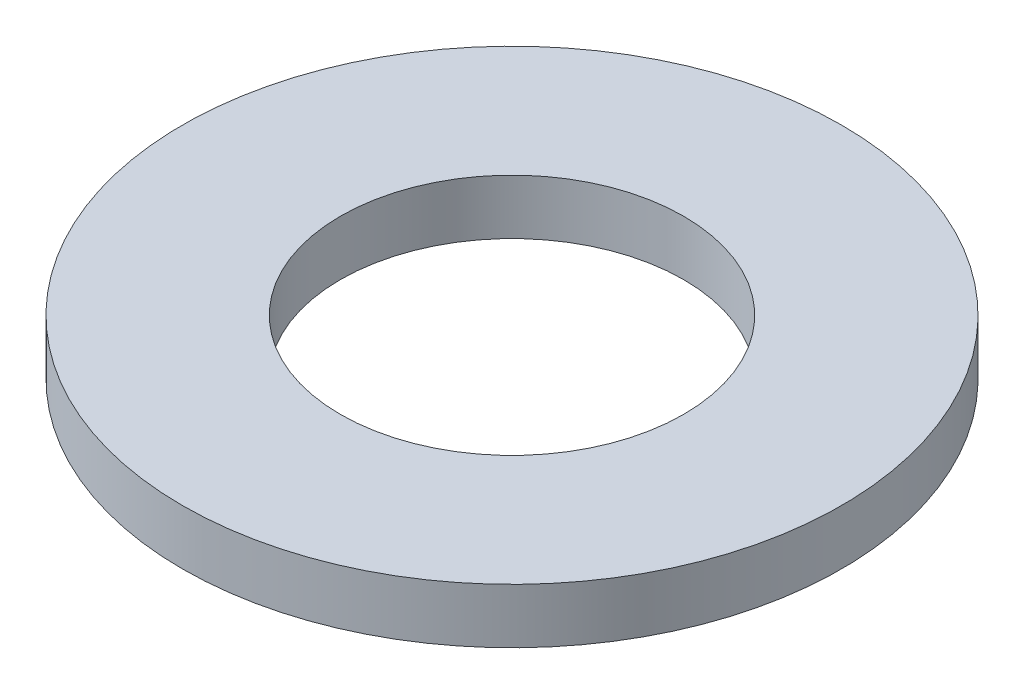
ISO-10303-21;
HEADER;
FILE_DESCRIPTION(('STEP AP214'),'2;1');
FILE_NAME('part.step','',(''),(''),'','','');
FILE_SCHEMA(('AUTOMOTIVE_DESIGN { 1 0 10303 214 1 1 1 1 }'));
ENDSEC;
DATA;
#1=APPLICATION_CONTEXT('core data for automotive mechanical design processes');
#2=APPLICATION_PROTOCOL_DEFINITION('international standard','automotive_design',2000,#1);
#3=PRODUCT_CONTEXT('',#1,'mechanical');
#4=PRODUCT('Part','Part','',(#3));
#5=PRODUCT_RELATED_PRODUCT_CATEGORY('part','',(#4));
#6=PRODUCT_DEFINITION_FORMATION('','',#4);
#7=PRODUCT_DEFINITION_CONTEXT('part definition',#1,'design');
#8=PRODUCT_DEFINITION('design','',#6,#7);
#9=PRODUCT_DEFINITION_SHAPE('','',#8);
#10=(LENGTH_UNIT() NAMED_UNIT(*) SI_UNIT(.MILLI.,.METRE.));
#11=(NAMED_UNIT(*) PLANE_ANGLE_UNIT() SI_UNIT($,.RADIAN.));
#12=(NAMED_UNIT(*) SI_UNIT($,.STERADIAN.) SOLID_ANGLE_UNIT());
#13=UNCERTAINTY_MEASURE_WITH_UNIT(LENGTH_MEASURE(1.E-05),#10,'distance_accuracy_value','');
#14=(GEOMETRIC_REPRESENTATION_CONTEXT(3) GLOBAL_UNCERTAINTY_ASSIGNED_CONTEXT((#13)) GLOBAL_UNIT_ASSIGNED_CONTEXT((#10,
#11,#12)) REPRESENTATION_CONTEXT('',''));
#15=CARTESIAN_POINT('',(0.,0.,0.));
#16=DIRECTION('',(0.,0.,1.));
#17=DIRECTION('',(1.,0.,0.));
#18=AXIS2_PLACEMENT_3D('',#15,#16,#17);
#19=CARTESIAN_POINT('',(0.,0.5,0.));
#20=DIRECTION('',(0.,1.,0.));
#21=DIRECTION('',(0.,0.,1.));
#22=AXIS2_PLACEMENT_3D('',#19,#20,#21);
#23=PLANE('',#22);
#24=CARTESIAN_POINT('',(0.,0.5,0.));
#25=DIRECTION('',(0.,1.,0.));
#26=DIRECTION('',(0.,0.,1.));
#27=AXIS2_PLACEMENT_3D('',#24,#25,#26);
#28=CIRCLE('',#27,6.);
#29=CARTESIAN_POINT('',(0.,0.5,6.));
#30=VERTEX_POINT('',#29);
#31=EDGE_CURVE('E10',#30,#30,#28,.T.);
#32=ORIENTED_EDGE('',*,*,#31,.T.);
#33=EDGE_LOOP('',(#32));
#34=FACE_BOUND('',#33,.T.);
#35=CARTESIAN_POINT('',(0.,0.5,0.));
#36=DIRECTION('',(0.,1.,0.));
#37=DIRECTION('',(0.,0.,1.));
#38=AXIS2_PLACEMENT_3D('',#35,#36,#37);
#39=CIRCLE('',#38,3.125);
#40=CARTESIAN_POINT('',(0.,0.5,3.125));
#41=VERTEX_POINT('',#40);
#42=EDGE_CURVE('E56',#41,#41,#39,.T.);
#43=ORIENTED_EDGE('',*,*,#42,.F.);
#44=EDGE_LOOP('',(#43));
#45=FACE_BOUND('',#44,.T.);
#46=ADVANCED_FACE('F43',(#34,#45),#23,.T.);
#47=CARTESIAN_POINT('',(0.,-0.5,0.));
#48=DIRECTION('',(0.,1.,0.));
#49=DIRECTION('',(0.,0.,1.));
#50=AXIS2_PLACEMENT_3D('',#47,#48,#49);
#51=PLANE('',#50);
#52=CARTESIAN_POINT('',(0.,-0.5,0.));
#53=DIRECTION('',(0.,1.,0.));
#54=DIRECTION('',(0.,0.,1.));
#55=AXIS2_PLACEMENT_3D('',#52,#53,#54);
#56=CIRCLE('',#55,6.);
#57=CARTESIAN_POINT('',(0.,-0.5,6.));
#58=VERTEX_POINT('',#57);
#59=EDGE_CURVE('E47',#58,#58,#56,.T.);
#60=ORIENTED_EDGE('',*,*,#59,.F.);
#61=EDGE_LOOP('',(#60));
#62=FACE_BOUND('',#61,.T.);
#63=CARTESIAN_POINT('',(0.,-0.5,0.));
#64=DIRECTION('',(0.,1.,0.));
#65=DIRECTION('',(0.,0.,1.));
#66=AXIS2_PLACEMENT_3D('',#63,#64,#65);
#67=CIRCLE('',#66,3.125);
#68=CARTESIAN_POINT('',(0.,-0.5,3.125));
#69=VERTEX_POINT('',#68);
#70=EDGE_CURVE('E58',#69,#69,#67,.T.);
#71=ORIENTED_EDGE('',*,*,#70,.T.);
#72=EDGE_LOOP('',(#71));
#73=FACE_BOUND('',#72,.T.);
#74=ADVANCED_FACE('F70',(#62,#73),#51,.F.);
#75=CARTESIAN_POINT('',(0.,0.5,0.));
#76=DIRECTION('',(0.,-1.,0.));
#77=DIRECTION('',(0.,0.,-1.));
#78=AXIS2_PLACEMENT_3D('',#75,#76,#77);
#79=CYLINDRICAL_SURFACE('',#78,6.);
#80=ORIENTED_EDGE('',*,*,#31,.F.);
#81=EDGE_LOOP('',(#80));
#82=FACE_BOUND('',#81,.T.);
#83=ORIENTED_EDGE('',*,*,#59,.T.);
#84=EDGE_LOOP('',(#83));
#85=FACE_BOUND('',#84,.T.);
#86=ADVANCED_FACE('F45',(#82,#85),#79,.T.);
#87=CARTESIAN_POINT('',(0.,0.5,0.));
#88=DIRECTION('',(0.,-1.,0.));
#89=DIRECTION('',(0.,0.,-1.));
#90=AXIS2_PLACEMENT_3D('',#87,#88,#89);
#91=CYLINDRICAL_SURFACE('',#90,3.125);
#92=ORIENTED_EDGE('',*,*,#42,.T.);
#93=EDGE_LOOP('',(#92));
#94=FACE_BOUND('',#93,.T.);
#95=ORIENTED_EDGE('',*,*,#70,.F.);
#96=EDGE_LOOP('',(#95));
#97=FACE_BOUND('',#96,.T.);
#98=ADVANCED_FACE('F66',(#94,#97),#91,.F.);
#99=CLOSED_SHELL('',(#46,#74,#86,#98));
#100=MANIFOLD_SOLID_BREP('B2',#99);
#101=ADVANCED_BREP_SHAPE_REPRESENTATION('',(#18,#100),#14);
#102=SHAPE_DEFINITION_REPRESENTATION(#9,#101);
ENDSEC;
END-ISO-10303-21;
